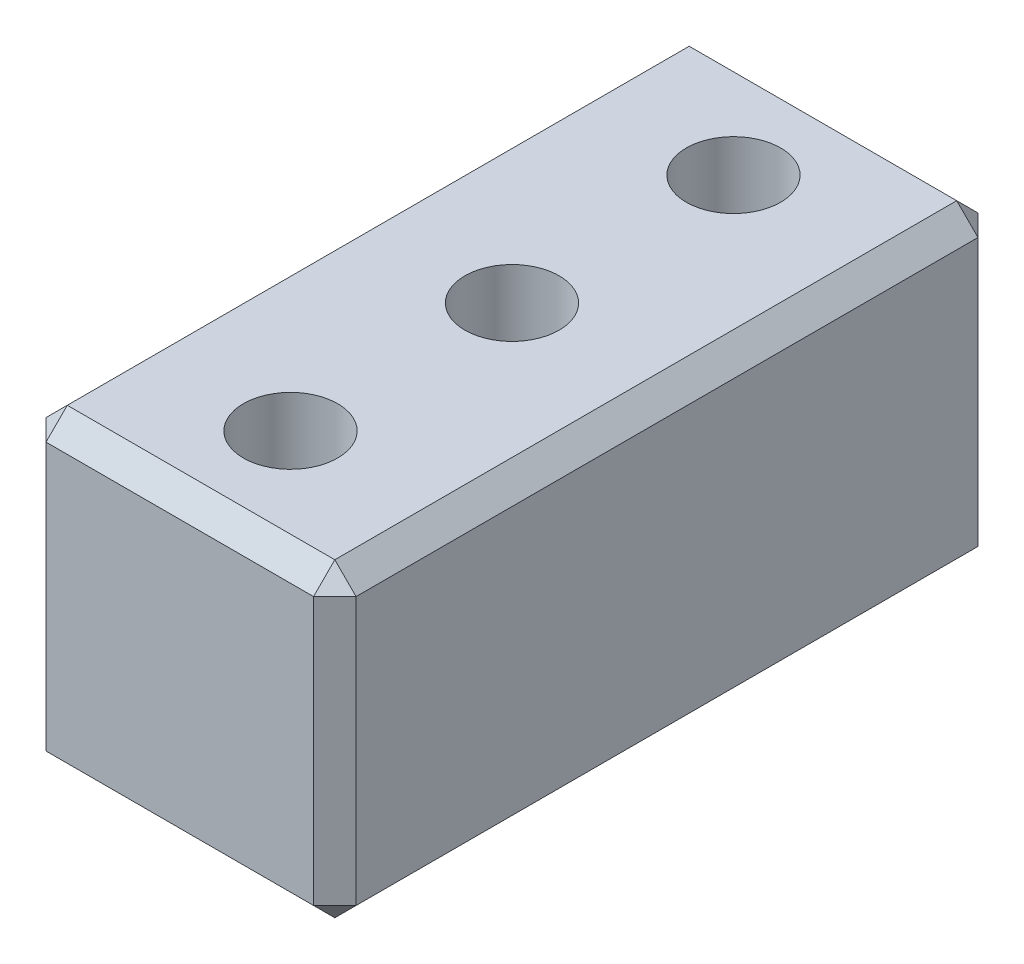
ISO-10303-21;
HEADER;
FILE_DESCRIPTION(('STEP AP214'),'2;1');
FILE_NAME('part.step','',(''),(''),'','','');
FILE_SCHEMA(('AUTOMOTIVE_DESIGN { 1 0 10303 214 1 1 1 1 }'));
ENDSEC;
DATA;
#1=APPLICATION_CONTEXT('core data for automotive mechanical design processes');
#2=APPLICATION_PROTOCOL_DEFINITION('international standard','automotive_design',2000,#1);
#3=PRODUCT_CONTEXT('',#1,'mechanical');
#4=PRODUCT('Part','Part','',(#3));
#5=PRODUCT_RELATED_PRODUCT_CATEGORY('part','',(#4));
#6=PRODUCT_DEFINITION_FORMATION('','',#4);
#7=PRODUCT_DEFINITION_CONTEXT('part definition',#1,'design');
#8=PRODUCT_DEFINITION('design','',#6,#7);
#9=PRODUCT_DEFINITION_SHAPE('','',#8);
#10=(LENGTH_UNIT() NAMED_UNIT(*) SI_UNIT(.MILLI.,.METRE.));
#11=(NAMED_UNIT(*) PLANE_ANGLE_UNIT() SI_UNIT($,.RADIAN.));
#12=(NAMED_UNIT(*) SI_UNIT($,.STERADIAN.) SOLID_ANGLE_UNIT());
#13=UNCERTAINTY_MEASURE_WITH_UNIT(LENGTH_MEASURE(1.E-05),#10,'distance_accuracy_value','');
#14=(GEOMETRIC_REPRESENTATION_CONTEXT(3) GLOBAL_UNCERTAINTY_ASSIGNED_CONTEXT((#13)) GLOBAL_UNIT_ASSIGNED_CONTEXT((#10,
#11,#12)) REPRESENTATION_CONTEXT('',''));
#15=CARTESIAN_POINT('',(0.,0.,0.));
#16=DIRECTION('',(0.,0.,1.));
#17=DIRECTION('',(1.,0.,0.));
#18=AXIS2_PLACEMENT_3D('',#15,#16,#17);
#19=CARTESIAN_POINT('',(-11.1125,-11.1125,23.8125));
#20=DIRECTION('',(1.,0.,0.));
#21=DIRECTION('',(0.,0.,-1.));
#22=AXIS2_PLACEMENT_3D('',#19,#20,#21);
#23=PLANE('',#22);
#24=DIRECTION('',(0.,1.,0.));
#25=VECTOR('',#24,1.);
#26=CARTESIAN_POINT('',(-11.1125,11.1125,22.2885));
#27=LINE('',#26,#25);
#28=CARTESIAN_POINT('',(-11.1125,-9.58849999999999,22.2885));
#29=VERTEX_POINT('',#28);
#30=CARTESIAN_POINT('',(-11.1125,9.5885,22.2885));
#31=VERTEX_POINT('',#30);
#32=EDGE_CURVE('E162',#29,#31,#27,.T.);
#33=ORIENTED_EDGE('',*,*,#32,.T.);
#34=DIRECTION('',(0.,0.,-1.));
#35=VECTOR('',#34,1.);
#36=CARTESIAN_POINT('',(-11.1125,9.5885,23.8125));
#37=LINE('',#36,#35);
#38=CARTESIAN_POINT('',(-11.1125,9.5885,-22.2885));
#39=VERTEX_POINT('',#38);
#40=EDGE_CURVE('E134',#31,#39,#37,.T.);
#41=ORIENTED_EDGE('',*,*,#40,.T.);
#42=DIRECTION('',(0.,-1.,0.));
#43=VECTOR('',#42,1.);
#44=CARTESIAN_POINT('',(-11.1125,-11.1125,-22.2885));
#45=LINE('',#44,#43);
#46=CARTESIAN_POINT('',(-11.1125,-9.58849999999999,-22.2885));
#47=VERTEX_POINT('',#46);
#48=EDGE_CURVE('E152',#39,#47,#45,.T.);
#49=ORIENTED_EDGE('',*,*,#48,.T.);
#50=DIRECTION('',(0.,0.,1.));
#51=VECTOR('',#50,1.);
#52=CARTESIAN_POINT('',(-11.1125,-9.58849999999999,23.8125));
#53=LINE('',#52,#51);
#54=EDGE_CURVE('E158',#47,#29,#53,.T.);
#55=ORIENTED_EDGE('',*,*,#54,.T.);
#56=EDGE_LOOP('',(#33,#41,#49,#55));
#57=FACE_BOUND('',#56,.T.);
#58=ADVANCED_FACE('F40',(#57),#23,.F.);
#59=CARTESIAN_POINT('',(11.1125,-11.1125,23.8125));
#60=DIRECTION('',(0.,1.,0.));
#61=DIRECTION('',(0.,0.,1.));
#62=AXIS2_PLACEMENT_3D('',#59,#60,#61);
#63=PLANE('',#62);
#64=DIRECTION('',(-1.,0.,0.));
#65=VECTOR('',#64,1.);
#66=CARTESIAN_POINT('',(-11.1125,-11.1125,22.2885));
#67=LINE('',#66,#65);
#68=CARTESIAN_POINT('',(9.5885,-11.1125,22.2885));
#69=VERTEX_POINT('',#68);
#70=CARTESIAN_POINT('',(-9.58850000000001,-11.1125,22.2885));
#71=VERTEX_POINT('',#70);
#72=EDGE_CURVE('E184',#69,#71,#67,.T.);
#73=ORIENTED_EDGE('',*,*,#72,.T.);
#74=DIRECTION('',(0.,0.,-1.));
#75=VECTOR('',#74,1.);
#76=CARTESIAN_POINT('',(-9.58850000000001,-11.1125,23.8125));
#77=LINE('',#76,#75);
#78=CARTESIAN_POINT('',(-9.58850000000001,-11.1125,-22.2885));
#79=VERTEX_POINT('',#78);
#80=EDGE_CURVE('E190',#71,#79,#77,.T.);
#81=ORIENTED_EDGE('',*,*,#80,.T.);
#82=DIRECTION('',(1.,0.,0.));
#83=VECTOR('',#82,1.);
#84=CARTESIAN_POINT('',(11.1125,-11.1125,-22.2885));
#85=LINE('',#84,#83);
#86=CARTESIAN_POINT('',(9.5885,-11.1125,-22.2885));
#87=VERTEX_POINT('',#86);
#88=EDGE_CURVE('E188',#79,#87,#85,.T.);
#89=ORIENTED_EDGE('',*,*,#88,.T.);
#90=DIRECTION('',(0.,0.,1.));
#91=VECTOR('',#90,1.);
#92=CARTESIAN_POINT('',(9.5885,-11.1125,23.8125));
#93=LINE('',#92,#91);
#94=EDGE_CURVE('E186',#87,#69,#93,.T.);
#95=ORIENTED_EDGE('',*,*,#94,.T.);
#96=EDGE_LOOP('',(#73,#81,#89,#95));
#97=FACE_BOUND('',#96,.T.);
#98=CARTESIAN_POINT('',(0.,-11.1125,-15.875));
#99=DIRECTION('',(0.,1.,0.));
#100=DIRECTION('',(0.,0.,1.));
#101=AXIS2_PLACEMENT_3D('',#98,#99,#100);
#102=CIRCLE('',#101,3.3782);
#103=CARTESIAN_POINT('',(0.,-11.1125,-12.4968));
#104=VERTEX_POINT('',#103);
#105=EDGE_CURVE('E267',#104,#104,#102,.T.);
#106=ORIENTED_EDGE('',*,*,#105,.T.);
#107=EDGE_LOOP('',(#106));
#108=FACE_BOUND('',#107,.T.);
#109=CARTESIAN_POINT('',(0.,-11.1125,15.875));
#110=DIRECTION('',(0.,1.,0.));
#111=DIRECTION('',(0.,0.,1.));
#112=AXIS2_PLACEMENT_3D('',#109,#110,#111);
#113=CIRCLE('',#112,3.3782);
#114=CARTESIAN_POINT('',(0.,-11.1125,19.2532));
#115=VERTEX_POINT('',#114);
#116=EDGE_CURVE('E277',#115,#115,#113,.T.);
#117=ORIENTED_EDGE('',*,*,#116,.T.);
#118=EDGE_LOOP('',(#117));
#119=FACE_BOUND('',#118,.T.);
#120=CARTESIAN_POINT('',(0.,-11.1125,0.));
#121=DIRECTION('',(0.,1.,0.));
#122=DIRECTION('',(0.,0.,1.));
#123=AXIS2_PLACEMENT_3D('',#120,#121,#122);
#124=CIRCLE('',#123,3.3782);
#125=CARTESIAN_POINT('',(0.,-11.1125,3.3782));
#126=VERTEX_POINT('',#125);
#127=EDGE_CURVE('E159',#126,#126,#124,.T.);
#128=ORIENTED_EDGE('',*,*,#127,.T.);
#129=EDGE_LOOP('',(#128));
#130=FACE_BOUND('',#129,.T.);
#131=ADVANCED_FACE('F338',(#97,#108,#119,#130),#63,.F.);
#132=CARTESIAN_POINT('',(11.1125,-11.1125,23.8125));
#133=DIRECTION('',(-1.,0.,0.));
#134=DIRECTION('',(0.,0.,1.));
#135=AXIS2_PLACEMENT_3D('',#132,#133,#134);
#136=PLANE('',#135);
#137=DIRECTION('',(0.,0.,-1.));
#138=VECTOR('',#137,1.);
#139=CARTESIAN_POINT('',(11.1125,-9.58849999999999,23.8125));
#140=LINE('',#139,#138);
#141=CARTESIAN_POINT('',(11.1125,-9.58849999999999,22.2885));
#142=VERTEX_POINT('',#141);
#143=CARTESIAN_POINT('',(11.1125,-9.58849999999999,-22.2885));
#144=VERTEX_POINT('',#143);
#145=EDGE_CURVE('E50',#142,#144,#140,.T.);
#146=ORIENTED_EDGE('',*,*,#145,.T.);
#147=DIRECTION('',(0.,1.,0.));
#148=VECTOR('',#147,1.);
#149=CARTESIAN_POINT('',(11.1125,-11.1125,-22.2885));
#150=LINE('',#149,#148);
#151=CARTESIAN_POINT('',(11.1125,9.5885,-22.2885));
#152=VERTEX_POINT('',#151);
#153=EDGE_CURVE('E11',#144,#152,#150,.T.);
#154=ORIENTED_EDGE('',*,*,#153,.T.);
#155=DIRECTION('',(0.,0.,1.));
#156=VECTOR('',#155,1.);
#157=CARTESIAN_POINT('',(11.1125,9.5885,23.8125));
#158=LINE('',#157,#156);
#159=CARTESIAN_POINT('',(11.1125,9.5885,22.2885));
#160=VERTEX_POINT('',#159);
#161=EDGE_CURVE('E202',#152,#160,#158,.T.);
#162=ORIENTED_EDGE('',*,*,#161,.T.);
#163=DIRECTION('',(0.,-1.,0.));
#164=VECTOR('',#163,1.);
#165=CARTESIAN_POINT('',(11.1125,-11.1125,22.2885));
#166=LINE('',#165,#164);
#167=EDGE_CURVE('E61',#160,#142,#166,.T.);
#168=ORIENTED_EDGE('',*,*,#167,.T.);
#169=EDGE_LOOP('',(#146,#154,#162,#168));
#170=FACE_BOUND('',#169,.T.);
#171=ADVANCED_FACE('F343',(#170),#136,.F.);
#172=CARTESIAN_POINT('',(11.1125,11.1125,23.8125));
#173=DIRECTION('',(0.,-1.,0.));
#174=DIRECTION('',(1.,0.,0.));
#175=AXIS2_PLACEMENT_3D('',#172,#173,#174);
#176=PLANE('',#175);
#177=DIRECTION('',(-1.,0.,0.));
#178=VECTOR('',#177,1.);
#179=CARTESIAN_POINT('',(11.1125,11.1125,-22.2885));
#180=LINE('',#179,#178);
#181=CARTESIAN_POINT('',(9.5885,11.1125,-22.2885));
#182=VERTEX_POINT('',#181);
#183=CARTESIAN_POINT('',(-9.58850000000001,11.1125,-22.2885));
#184=VERTEX_POINT('',#183);
#185=EDGE_CURVE('E172',#182,#184,#180,.T.);
#186=ORIENTED_EDGE('',*,*,#185,.T.);
#187=DIRECTION('',(0.,0.,1.));
#188=VECTOR('',#187,1.);
#189=CARTESIAN_POINT('',(-9.58850000000001,11.1125,23.8125));
#190=LINE('',#189,#188);
#191=CARTESIAN_POINT('',(-9.58850000000001,11.1125,22.2885));
#192=VERTEX_POINT('',#191);
#193=EDGE_CURVE('E136',#184,#192,#190,.T.);
#194=ORIENTED_EDGE('',*,*,#193,.T.);
#195=DIRECTION('',(1.,0.,0.));
#196=VECTOR('',#195,1.);
#197=CARTESIAN_POINT('',(11.1125,11.1125,22.2885));
#198=LINE('',#197,#196);
#199=CARTESIAN_POINT('',(9.5885,11.1125,22.2885));
#200=VERTEX_POINT('',#199);
#201=EDGE_CURVE('E166',#192,#200,#198,.T.);
#202=ORIENTED_EDGE('',*,*,#201,.T.);
#203=DIRECTION('',(0.,0.,-1.));
#204=VECTOR('',#203,1.);
#205=CARTESIAN_POINT('',(9.5885,11.1125,23.8125));
#206=LINE('',#205,#204);
#207=EDGE_CURVE('E164',#200,#182,#206,.T.);
#208=ORIENTED_EDGE('',*,*,#207,.T.);
#209=EDGE_LOOP('',(#186,#194,#202,#208));
#210=FACE_BOUND('',#209,.T.);
#211=CARTESIAN_POINT('',(0.,11.1125,-15.875));
#212=DIRECTION('',(0.,1.,0.));
#213=DIRECTION('',(0.,0.,1.));
#214=AXIS2_PLACEMENT_3D('',#211,#212,#213);
#215=CIRCLE('',#214,3.37819999999999);
#216=CARTESIAN_POINT('',(0.,11.1125,-12.4968));
#217=VERTEX_POINT('',#216);
#218=EDGE_CURVE('E261',#217,#217,#215,.T.);
#219=ORIENTED_EDGE('',*,*,#218,.F.);
#220=EDGE_LOOP('',(#219));
#221=FACE_BOUND('',#220,.T.);
#222=CARTESIAN_POINT('',(0.,11.1125,15.875));
#223=DIRECTION('',(0.,1.,0.));
#224=DIRECTION('',(0.,0.,1.));
#225=AXIS2_PLACEMENT_3D('',#222,#223,#224);
#226=CIRCLE('',#225,3.37819999999999);
#227=CARTESIAN_POINT('',(0.,11.1125,19.2532));
#228=VERTEX_POINT('',#227);
#229=EDGE_CURVE('E272',#228,#228,#226,.T.);
#230=ORIENTED_EDGE('',*,*,#229,.F.);
#231=EDGE_LOOP('',(#230));
#232=FACE_BOUND('',#231,.T.);
#233=CARTESIAN_POINT('',(0.,11.1125,0.));
#234=DIRECTION('',(0.,1.,0.));
#235=DIRECTION('',(0.,0.,1.));
#236=AXIS2_PLACEMENT_3D('',#233,#234,#235);
#237=CIRCLE('',#236,3.37819999999999);
#238=CARTESIAN_POINT('',(0.,11.1125,3.37819999999999));
#239=VERTEX_POINT('',#238);
#240=EDGE_CURVE('E280',#239,#239,#237,.T.);
#241=ORIENTED_EDGE('',*,*,#240,.F.);
#242=EDGE_LOOP('',(#241));
#243=FACE_BOUND('',#242,.T.);
#244=ADVANCED_FACE('F308',(#210,#221,#232,#243),#176,.F.);
#245=CARTESIAN_POINT('',(0.,0.,23.8125));
#246=DIRECTION('',(0.,0.,1.));
#247=DIRECTION('',(1.,0.,0.));
#248=AXIS2_PLACEMENT_3D('',#245,#246,#247);
#249=PLANE('',#248);
#250=DIRECTION('',(-1.,0.,0.));
#251=VECTOR('',#250,1.);
#252=CARTESIAN_POINT('',(-11.1125,9.5885,23.8125));
#253=LINE('',#252,#251);
#254=CARTESIAN_POINT('',(9.5885,9.5885,23.8125));
#255=VERTEX_POINT('',#254);
#256=CARTESIAN_POINT('',(-9.58850000000001,9.5885,23.8125));
#257=VERTEX_POINT('',#256);
#258=EDGE_CURVE('E175',#255,#257,#253,.T.);
#259=ORIENTED_EDGE('',*,*,#258,.T.);
#260=DIRECTION('',(0.,-1.,0.));
#261=VECTOR('',#260,1.);
#262=CARTESIAN_POINT('',(-9.58850000000001,-11.1125,23.8125));
#263=LINE('',#262,#261);
#264=CARTESIAN_POINT('',(-9.58850000000001,-9.58849999999999,23.8125));
#265=VERTEX_POINT('',#264);
#266=EDGE_CURVE('E181',#257,#265,#263,.T.);
#267=ORIENTED_EDGE('',*,*,#266,.T.);
#268=DIRECTION('',(1.,0.,0.));
#269=VECTOR('',#268,1.);
#270=CARTESIAN_POINT('',(11.1125,-9.58849999999999,23.8125));
#271=LINE('',#270,#269);
#272=CARTESIAN_POINT('',(9.5885,-9.58849999999999,23.8125));
#273=VERTEX_POINT('',#272);
#274=EDGE_CURVE('E179',#265,#273,#271,.T.);
#275=ORIENTED_EDGE('',*,*,#274,.T.);
#276=DIRECTION('',(0.,1.,0.));
#277=VECTOR('',#276,1.);
#278=CARTESIAN_POINT('',(9.5885,11.1125,23.8125));
#279=LINE('',#278,#277);
#280=EDGE_CURVE('E177',#273,#255,#279,.T.);
#281=ORIENTED_EDGE('',*,*,#280,.T.);
#282=EDGE_LOOP('',(#259,#267,#275,#281));
#283=FACE_BOUND('',#282,.T.);
#284=ADVANCED_FACE('F455',(#283),#249,.T.);
#285=CARTESIAN_POINT('',(0.,0.,-23.8125));
#286=DIRECTION('',(0.,0.,1.));
#287=DIRECTION('',(1.,0.,0.));
#288=AXIS2_PLACEMENT_3D('',#285,#286,#287);
#289=PLANE('',#288);
#290=DIRECTION('',(-1.,0.,0.));
#291=VECTOR('',#290,1.);
#292=CARTESIAN_POINT('',(0.,-9.58849999999999,-23.8125));
#293=LINE('',#292,#291);
#294=CARTESIAN_POINT('',(9.5885,-9.58849999999999,-23.8125));
#295=VERTEX_POINT('',#294);
#296=CARTESIAN_POINT('',(-9.5885,-9.58849999999999,-23.8125));
#297=VERTEX_POINT('',#296);
#298=EDGE_CURVE('E193',#295,#297,#293,.T.);
#299=ORIENTED_EDGE('',*,*,#298,.T.);
#300=DIRECTION('',(0.,1.,0.));
#301=VECTOR('',#300,1.);
#302=CARTESIAN_POINT('',(-9.5885,0.,-23.8125));
#303=LINE('',#302,#301);
#304=CARTESIAN_POINT('',(-9.5885,9.5885,-23.8125));
#305=VERTEX_POINT('',#304);
#306=EDGE_CURVE('E199',#297,#305,#303,.T.);
#307=ORIENTED_EDGE('',*,*,#306,.T.);
#308=DIRECTION('',(1.,0.,0.));
#309=VECTOR('',#308,1.);
#310=CARTESIAN_POINT('',(0.,9.5885,-23.8125));
#311=LINE('',#310,#309);
#312=CARTESIAN_POINT('',(9.5885,9.5885,-23.8125));
#313=VERTEX_POINT('',#312);
#314=EDGE_CURVE('E197',#305,#313,#311,.T.);
#315=ORIENTED_EDGE('',*,*,#314,.T.);
#316=DIRECTION('',(0.,-1.,0.));
#317=VECTOR('',#316,1.);
#318=CARTESIAN_POINT('',(9.5885,0.,-23.8125));
#319=LINE('',#318,#317);
#320=EDGE_CURVE('E195',#313,#295,#319,.T.);
#321=ORIENTED_EDGE('',*,*,#320,.T.);
#322=EDGE_LOOP('',(#299,#307,#315,#321));
#323=FACE_BOUND('',#322,.T.);
#324=ADVANCED_FACE('F317',(#323),#289,.F.);
#325=CARTESIAN_POINT('',(0.,11.1125,0.));
#326=DIRECTION('',(0.,1.,0.));
#327=DIRECTION('',(0.,0.,1.));
#328=AXIS2_PLACEMENT_3D('',#325,#326,#327);
#329=CYLINDRICAL_SURFACE('',#328,3.37819999999999);
#330=ORIENTED_EDGE('',*,*,#127,.F.);
#331=EDGE_LOOP('',(#330));
#332=FACE_BOUND('',#331,.T.);
#333=ORIENTED_EDGE('',*,*,#240,.T.);
#334=EDGE_LOOP('',(#333));
#335=FACE_BOUND('',#334,.T.);
#336=ADVANCED_FACE('F462',(#332,#335),#329,.F.);
#337=CARTESIAN_POINT('',(0.,11.1125,15.875));
#338=DIRECTION('',(0.,1.,0.));
#339=DIRECTION('',(0.,0.,1.));
#340=AXIS2_PLACEMENT_3D('',#337,#338,#339);
#341=CYLINDRICAL_SURFACE('',#340,3.37819999999999);
#342=ORIENTED_EDGE('',*,*,#116,.F.);
#343=EDGE_LOOP('',(#342));
#344=FACE_BOUND('',#343,.T.);
#345=ORIENTED_EDGE('',*,*,#229,.T.);
#346=EDGE_LOOP('',(#345));
#347=FACE_BOUND('',#346,.T.);
#348=ADVANCED_FACE('F663',(#344,#347),#341,.F.);
#349=CARTESIAN_POINT('',(0.,11.1125,-15.875));
#350=DIRECTION('',(0.,1.,0.));
#351=DIRECTION('',(0.,0.,1.));
#352=AXIS2_PLACEMENT_3D('',#349,#350,#351);
#353=CYLINDRICAL_SURFACE('',#352,3.37819999999999);
#354=ORIENTED_EDGE('',*,*,#105,.F.);
#355=EDGE_LOOP('',(#354));
#356=FACE_BOUND('',#355,.T.);
#357=ORIENTED_EDGE('',*,*,#218,.T.);
#358=EDGE_LOOP('',(#357));
#359=FACE_BOUND('',#358,.T.);
#360=ADVANCED_FACE('F438',(#356,#359),#353,.F.);
#361=CARTESIAN_POINT('',(11.1125,-9.58849999999999,23.8125));
#362=DIRECTION('',(-0.707106781186549,0.707106781186546,0.));
#363=DIRECTION('',(0.,0.,-1.));
#364=AXIS2_PLACEMENT_3D('',#361,#362,#363);
#365=PLANE('',#364);
#366=DIRECTION('',(-0.707106781186546,-0.707106781186549,0.));
#367=VECTOR('',#366,1.);
#368=CARTESIAN_POINT('',(9.5885,-11.1125,22.2885));
#369=LINE('',#368,#367);
#370=EDGE_CURVE('E45',#69,#142,#369,.F.);
#371=ORIENTED_EDGE('',*,*,#370,.F.);
#372=ORIENTED_EDGE('',*,*,#94,.F.);
#373=DIRECTION('',(0.707106781186546,0.707106781186549,0.));
#374=VECTOR('',#373,1.);
#375=CARTESIAN_POINT('',(10.3505,-10.3505,-22.2885));
#376=LINE('',#375,#374);
#377=EDGE_CURVE('E255',#144,#87,#376,.F.);
#378=ORIENTED_EDGE('',*,*,#377,.F.);
#379=ORIENTED_EDGE('',*,*,#145,.F.);
#380=EDGE_LOOP('',(#371,#372,#378,#379));
#381=FACE_BOUND('',#380,.T.);
#382=ADVANCED_FACE('F43',(#381),#365,.F.);
#383=CARTESIAN_POINT('',(9.5885,-11.1125,22.2885));
#384=DIRECTION('',(0.577350269189628,-0.577350269189626,0.577350269189623));
#385=DIRECTION('',(0.707106781186546,0.707106781186549,0.));
#386=AXIS2_PLACEMENT_3D('',#383,#384,#385);
#387=PLANE('',#386);
#388=DIRECTION('',(0.,-0.707106781186546,-0.707106781186549));
#389=VECTOR('',#388,1.);
#390=CARTESIAN_POINT('',(9.5885,-11.1125,22.2885));
#391=LINE('',#390,#389);
#392=EDGE_CURVE('E250',#69,#273,#391,.F.);
#393=ORIENTED_EDGE('',*,*,#392,.F.);
#394=ORIENTED_EDGE('',*,*,#370,.T.);
#395=DIRECTION('',(-0.707106781186546,0.,0.707106781186549));
#396=VECTOR('',#395,1.);
#397=CARTESIAN_POINT('',(10.3505,-9.58849999999999,23.0505));
#398=LINE('',#397,#396);
#399=EDGE_CURVE('E253',#273,#142,#398,.F.);
#400=ORIENTED_EDGE('',*,*,#399,.F.);
#401=EDGE_LOOP('',(#393,#394,#400));
#402=FACE_BOUND('',#401,.T.);
#403=ADVANCED_FACE('F430',(#402),#387,.T.);
#404=CARTESIAN_POINT('',(9.5885,-9.58849999999999,-23.8125));
#405=DIRECTION('',(0.577350269189628,-0.577350269189623,-0.577350269189626));
#406=DIRECTION('',(-0.707106781186546,0.,-0.707106781186549));
#407=AXIS2_PLACEMENT_3D('',#404,#405,#406);
#408=PLANE('',#407);
#409=DIRECTION('',(-0.707106781186546,0.,-0.707106781186549));
#410=VECTOR('',#409,1.);
#411=CARTESIAN_POINT('',(9.5885,-9.58849999999999,-23.8125));
#412=LINE('',#411,#410);
#413=EDGE_CURVE('E244',#144,#295,#412,.T.);
#414=ORIENTED_EDGE('',*,*,#413,.F.);
#415=ORIENTED_EDGE('',*,*,#377,.T.);
#416=DIRECTION('',(0.,-0.707106781186549,0.707106781186546));
#417=VECTOR('',#416,1.);
#418=CARTESIAN_POINT('',(9.5885,-9.58849999999999,-23.8125));
#419=LINE('',#418,#417);
#420=EDGE_CURVE('E247',#295,#87,#419,.T.);
#421=ORIENTED_EDGE('',*,*,#420,.F.);
#422=EDGE_LOOP('',(#414,#415,#421));
#423=FACE_BOUND('',#422,.T.);
#424=ADVANCED_FACE('F427',(#423),#408,.T.);
#425=CARTESIAN_POINT('',(9.5885,0.,23.8125));
#426=DIRECTION('',(0.707106781186549,0.,0.707106781186546));
#427=DIRECTION('',(0.,-1.,0.));
#428=AXIS2_PLACEMENT_3D('',#425,#426,#427);
#429=PLANE('',#428);
#430=ORIENTED_EDGE('',*,*,#399,.T.);
#431=ORIENTED_EDGE('',*,*,#167,.F.);
#432=DIRECTION('',(0.707106781186546,0.,-0.707106781186549));
#433=VECTOR('',#432,1.);
#434=CARTESIAN_POINT('',(9.5885,9.5885,23.8125));
#435=LINE('',#434,#433);
#436=EDGE_CURVE('E238',#255,#160,#435,.T.);
#437=ORIENTED_EDGE('',*,*,#436,.F.);
#438=ORIENTED_EDGE('',*,*,#280,.F.);
#439=EDGE_LOOP('',(#430,#431,#437,#438));
#440=FACE_BOUND('',#439,.T.);
#441=ADVANCED_FACE('F422',(#440),#429,.T.);
#442=CARTESIAN_POINT('',(0.,-9.58849999999999,23.8125));
#443=DIRECTION('',(0.,-0.707106781186549,0.707106781186546));
#444=DIRECTION('',(-1.,0.,0.));
#445=AXIS2_PLACEMENT_3D('',#442,#443,#444);
#446=PLANE('',#445);
#447=ORIENTED_EDGE('',*,*,#392,.T.);
#448=ORIENTED_EDGE('',*,*,#274,.F.);
#449=DIRECTION('',(0.,0.707106781186546,0.707106781186549));
#450=VECTOR('',#449,1.);
#451=CARTESIAN_POINT('',(-9.58850000000001,-9.58849999999999,23.8125));
#452=LINE('',#451,#450);
#453=EDGE_CURVE('E235',#71,#265,#452,.T.);
#454=ORIENTED_EDGE('',*,*,#453,.F.);
#455=ORIENTED_EDGE('',*,*,#72,.F.);
#456=EDGE_LOOP('',(#447,#448,#454,#455));
#457=FACE_BOUND('',#456,.T.);
#458=ADVANCED_FACE('F417',(#457),#446,.T.);
#459=CARTESIAN_POINT('',(-9.58850000000001,-11.1125,23.8125));
#460=DIRECTION('',(0.707106781186549,0.707106781186546,0.));
#461=DIRECTION('',(0.,0.,-1.));
#462=AXIS2_PLACEMENT_3D('',#459,#460,#461);
#463=PLANE('',#462);
#464=DIRECTION('',(0.707106781186546,-0.707106781186549,0.));
#465=VECTOR('',#464,1.);
#466=CARTESIAN_POINT('',(-9.58850000000001,-11.1125,-22.2885));
#467=LINE('',#466,#465);
#468=EDGE_CURVE('E229',#79,#47,#467,.F.);
#469=ORIENTED_EDGE('',*,*,#468,.F.);
#470=ORIENTED_EDGE('',*,*,#80,.F.);
#471=DIRECTION('',(-0.707106781186546,0.707106781186549,0.));
#472=VECTOR('',#471,1.);
#473=CARTESIAN_POINT('',(-10.3505,-10.3505,22.2885));
#474=LINE('',#473,#472);
#475=EDGE_CURVE('E232',#29,#71,#474,.F.);
#476=ORIENTED_EDGE('',*,*,#475,.F.);
#477=ORIENTED_EDGE('',*,*,#54,.F.);
#478=EDGE_LOOP('',(#469,#470,#476,#477));
#479=FACE_BOUND('',#478,.T.);
#480=ADVANCED_FACE('F289',(#479),#463,.F.);
#481=CARTESIAN_POINT('',(11.1125,-11.1125,-22.2885));
#482=DIRECTION('',(0.,0.707106781186546,0.707106781186549));
#483=DIRECTION('',(1.,0.,0.));
#484=AXIS2_PLACEMENT_3D('',#481,#482,#483);
#485=PLANE('',#484);
#486=ORIENTED_EDGE('',*,*,#420,.T.);
#487=ORIENTED_EDGE('',*,*,#88,.F.);
#488=DIRECTION('',(0.,0.707106781186549,-0.707106781186546));
#489=VECTOR('',#488,1.);
#490=CARTESIAN_POINT('',(-9.58850000000001,-11.1125,-22.2885));
#491=LINE('',#490,#489);
#492=EDGE_CURVE('E227',#297,#79,#491,.F.);
#493=ORIENTED_EDGE('',*,*,#492,.F.);
#494=ORIENTED_EDGE('',*,*,#298,.F.);
#495=EDGE_LOOP('',(#486,#487,#493,#494));
#496=FACE_BOUND('',#495,.T.);
#497=ADVANCED_FACE('F322',(#496),#485,.F.);
#498=CARTESIAN_POINT('',(11.1125,-11.1125,-22.2885));
#499=DIRECTION('',(-0.707106781186549,0.,0.707106781186546));
#500=DIRECTION('',(0.,1.,0.));
#501=AXIS2_PLACEMENT_3D('',#498,#499,#500);
#502=PLANE('',#501);
#503=ORIENTED_EDGE('',*,*,#413,.T.);
#504=ORIENTED_EDGE('',*,*,#320,.F.);
#505=DIRECTION('',(0.707106781186546,0.,0.707106781186549));
#506=VECTOR('',#505,1.);
#507=CARTESIAN_POINT('',(9.5885,9.5885,-23.8125));
#508=LINE('',#507,#506);
#509=EDGE_CURVE('E224',#152,#313,#508,.F.);
#510=ORIENTED_EDGE('',*,*,#509,.F.);
#511=ORIENTED_EDGE('',*,*,#153,.F.);
#512=EDGE_LOOP('',(#503,#504,#510,#511));
#513=FACE_BOUND('',#512,.T.);
#514=ADVANCED_FACE('F404',(#513),#502,.F.);
#515=CARTESIAN_POINT('',(9.5885,11.1125,23.8125));
#516=DIRECTION('',(-0.707106781186549,-0.707106781186546,0.));
#517=DIRECTION('',(0.,0.,-1.));
#518=AXIS2_PLACEMENT_3D('',#515,#516,#517);
#519=PLANE('',#518);
#520=DIRECTION('',(0.707106781186546,-0.707106781186549,0.));
#521=VECTOR('',#520,1.);
#522=CARTESIAN_POINT('',(10.3505,10.3505,22.2885));
#523=LINE('',#522,#521);
#524=EDGE_CURVE('E241',#160,#200,#523,.F.);
#525=ORIENTED_EDGE('',*,*,#524,.F.);
#526=ORIENTED_EDGE('',*,*,#161,.F.);
#527=DIRECTION('',(-0.707106781186546,0.707106781186549,0.));
#528=VECTOR('',#527,1.);
#529=CARTESIAN_POINT('',(10.3505,10.3505,-22.2885));
#530=LINE('',#529,#528);
#531=EDGE_CURVE('E222',#182,#152,#530,.F.);
#532=ORIENTED_EDGE('',*,*,#531,.F.);
#533=ORIENTED_EDGE('',*,*,#207,.F.);
#534=EDGE_LOOP('',(#525,#526,#532,#533));
#535=FACE_BOUND('',#534,.T.);
#536=ADVANCED_FACE('F399',(#535),#519,.F.);
#537=CARTESIAN_POINT('',(9.5885,9.5885,23.8125));
#538=DIRECTION('',(0.577350269189628,0.577350269189623,0.577350269189626));
#539=DIRECTION('',(0.707106781186546,0.,-0.707106781186549));
#540=AXIS2_PLACEMENT_3D('',#537,#538,#539);
#541=PLANE('',#540);
#542=ORIENTED_EDGE('',*,*,#436,.T.);
#543=ORIENTED_EDGE('',*,*,#524,.T.);
#544=DIRECTION('',(0.,-0.707106781186549,0.707106781186546));
#545=VECTOR('',#544,1.);
#546=CARTESIAN_POINT('',(9.5885,9.5885,23.8125));
#547=LINE('',#546,#545);
#548=EDGE_CURVE('E219',#255,#200,#547,.F.);
#549=ORIENTED_EDGE('',*,*,#548,.F.);
#550=EDGE_LOOP('',(#542,#543,#549));
#551=FACE_BOUND('',#550,.T.);
#552=ADVANCED_FACE('F334',(#551),#541,.T.);
#553=CARTESIAN_POINT('',(-9.58850000000001,-9.58849999999999,23.8125));
#554=DIRECTION('',(-0.577350269189628,-0.577350269189626,0.577350269189623));
#555=DIRECTION('',(0.707106781186546,-0.707106781186549,0.));
#556=AXIS2_PLACEMENT_3D('',#553,#554,#555);
#557=PLANE('',#556);
#558=ORIENTED_EDGE('',*,*,#475,.T.);
#559=ORIENTED_EDGE('',*,*,#453,.T.);
#560=DIRECTION('',(-0.707106781186546,0.,-0.707106781186549));
#561=VECTOR('',#560,1.);
#562=CARTESIAN_POINT('',(-9.58850000000001,-9.58849999999999,23.8125));
#563=LINE('',#562,#561);
#564=EDGE_CURVE('E217',#29,#265,#563,.F.);
#565=ORIENTED_EDGE('',*,*,#564,.F.);
#566=EDGE_LOOP('',(#558,#559,#565));
#567=FACE_BOUND('',#566,.T.);
#568=ADVANCED_FACE('F292',(#567),#557,.T.);
#569=CARTESIAN_POINT('',(-9.58850000000001,-11.1125,-22.2885));
#570=DIRECTION('',(-0.577350269189626,-0.577350269189623,-0.577350269189628));
#571=DIRECTION('',(-0.707106781186549,0.,0.707106781186546));
#572=AXIS2_PLACEMENT_3D('',#569,#570,#571);
#573=PLANE('',#572);
#574=ORIENTED_EDGE('',*,*,#492,.T.);
#575=ORIENTED_EDGE('',*,*,#468,.T.);
#576=DIRECTION('',(-0.707106781186549,0.,0.707106781186546));
#577=VECTOR('',#576,1.);
#578=CARTESIAN_POINT('',(-10.3505,-9.58849999999999,-23.0505));
#579=LINE('',#578,#577);
#580=EDGE_CURVE('E155',#297,#47,#579,.T.);
#581=ORIENTED_EDGE('',*,*,#580,.F.);
#582=EDGE_LOOP('',(#574,#575,#581));
#583=FACE_BOUND('',#582,.T.);
#584=ADVANCED_FACE('F324',(#583),#573,.T.);
#585=CARTESIAN_POINT('',(9.5885,9.5885,-23.8125));
#586=DIRECTION('',(0.577350269189628,0.577350269189623,-0.577350269189626));
#587=DIRECTION('',(-0.707106781186546,0.,-0.707106781186549));
#588=AXIS2_PLACEMENT_3D('',#585,#586,#587);
#589=PLANE('',#588);
#590=ORIENTED_EDGE('',*,*,#531,.T.);
#591=ORIENTED_EDGE('',*,*,#509,.T.);
#592=DIRECTION('',(0.,-0.707106781186549,-0.707106781186546));
#593=VECTOR('',#592,1.);
#594=CARTESIAN_POINT('',(9.5885,9.5885,-23.8125));
#595=LINE('',#594,#593);
#596=EDGE_CURVE('E213',#182,#313,#595,.T.);
#597=ORIENTED_EDGE('',*,*,#596,.F.);
#598=EDGE_LOOP('',(#590,#591,#597));
#599=FACE_BOUND('',#598,.T.);
#600=ADVANCED_FACE('F326',(#599),#589,.T.);
#601=CARTESIAN_POINT('',(0.,9.5885,23.8125));
#602=DIRECTION('',(0.,0.707106781186546,0.707106781186549));
#603=DIRECTION('',(1.,0.,0.));
#604=AXIS2_PLACEMENT_3D('',#601,#602,#603);
#605=PLANE('',#604);
#606=ORIENTED_EDGE('',*,*,#548,.T.);
#607=ORIENTED_EDGE('',*,*,#201,.F.);
#608=DIRECTION('',(0.,0.707106781186549,-0.707106781186546));
#609=VECTOR('',#608,1.);
#610=CARTESIAN_POINT('',(-9.58850000000001,11.1125,22.2885));
#611=LINE('',#610,#609);
#612=EDGE_CURVE('E210',#257,#192,#611,.T.);
#613=ORIENTED_EDGE('',*,*,#612,.F.);
#614=ORIENTED_EDGE('',*,*,#258,.F.);
#615=EDGE_LOOP('',(#606,#607,#613,#614));
#616=FACE_BOUND('',#615,.T.);
#617=ADVANCED_FACE('F304',(#616),#605,.T.);
#618=CARTESIAN_POINT('',(-9.58850000000001,0.,23.8125));
#619=DIRECTION('',(-0.707106781186549,0.,0.707106781186546));
#620=DIRECTION('',(0.,1.,0.));
#621=AXIS2_PLACEMENT_3D('',#618,#619,#620);
#622=PLANE('',#621);
#623=ORIENTED_EDGE('',*,*,#564,.T.);
#624=ORIENTED_EDGE('',*,*,#266,.F.);
#625=DIRECTION('',(0.707106781186546,0.,0.707106781186549));
#626=VECTOR('',#625,1.);
#627=CARTESIAN_POINT('',(-10.3505,9.5885,23.0505));
#628=LINE('',#627,#626);
#629=EDGE_CURVE('E149',#31,#257,#628,.T.);
#630=ORIENTED_EDGE('',*,*,#629,.F.);
#631=ORIENTED_EDGE('',*,*,#32,.F.);
#632=EDGE_LOOP('',(#623,#624,#630,#631));
#633=FACE_BOUND('',#632,.T.);
#634=ADVANCED_FACE('F296',(#633),#622,.T.);
#635=CARTESIAN_POINT('',(-11.1125,-11.1125,-22.2885));
#636=DIRECTION('',(0.707106781186546,0.,0.707106781186549));
#637=DIRECTION('',(0.,-1.,0.));
#638=AXIS2_PLACEMENT_3D('',#635,#636,#637);
#639=PLANE('',#638);
#640=ORIENTED_EDGE('',*,*,#580,.T.);
#641=ORIENTED_EDGE('',*,*,#48,.F.);
#642=DIRECTION('',(0.707106781186549,0.,-0.707106781186546));
#643=VECTOR('',#642,1.);
#644=CARTESIAN_POINT('',(-11.1125,9.5885,-22.2885));
#645=LINE('',#644,#643);
#646=EDGE_CURVE('E141',#305,#39,#645,.F.);
#647=ORIENTED_EDGE('',*,*,#646,.F.);
#648=ORIENTED_EDGE('',*,*,#306,.F.);
#649=EDGE_LOOP('',(#640,#641,#647,#648));
#650=FACE_BOUND('',#649,.T.);
#651=ADVANCED_FACE('F153',(#650),#639,.F.);
#652=CARTESIAN_POINT('',(11.1125,11.1125,-22.2885));
#653=DIRECTION('',(0.,-0.707106781186546,0.707106781186549));
#654=DIRECTION('',(-1.,0.,0.));
#655=AXIS2_PLACEMENT_3D('',#652,#653,#654);
#656=PLANE('',#655);
#657=ORIENTED_EDGE('',*,*,#596,.T.);
#658=ORIENTED_EDGE('',*,*,#314,.F.);
#659=DIRECTION('',(0.,0.707106781186549,0.707106781186546));
#660=VECTOR('',#659,1.);
#661=CARTESIAN_POINT('',(-9.5885,10.3505,-23.0505));
#662=LINE('',#661,#660);
#663=EDGE_CURVE('E145',#184,#305,#662,.F.);
#664=ORIENTED_EDGE('',*,*,#663,.F.);
#665=ORIENTED_EDGE('',*,*,#185,.F.);
#666=EDGE_LOOP('',(#657,#658,#664,#665));
#667=FACE_BOUND('',#666,.T.);
#668=ADVANCED_FACE('F313',(#667),#656,.F.);
#669=CARTESIAN_POINT('',(-9.58850000000001,11.1125,22.2885));
#670=DIRECTION('',(-0.577350269189628,0.577350269189623,0.577350269189626));
#671=DIRECTION('',(0.707106781186546,0.,0.707106781186549));
#672=AXIS2_PLACEMENT_3D('',#669,#670,#671);
#673=PLANE('',#672);
#674=ORIENTED_EDGE('',*,*,#629,.T.);
#675=ORIENTED_EDGE('',*,*,#612,.T.);
#676=DIRECTION('',(0.707106781186546,0.707106781186549,0.));
#677=VECTOR('',#676,1.);
#678=CARTESIAN_POINT('',(-9.58850000000001,11.1125,22.2885));
#679=LINE('',#678,#677);
#680=EDGE_CURVE('E138',#31,#192,#679,.T.);
#681=ORIENTED_EDGE('',*,*,#680,.F.);
#682=EDGE_LOOP('',(#674,#675,#681));
#683=FACE_BOUND('',#682,.T.);
#684=ADVANCED_FACE('F300',(#683),#673,.T.);
#685=CARTESIAN_POINT('',(-11.1125,9.5885,-22.2885));
#686=DIRECTION('',(-0.577350269189626,0.577350269189623,-0.577350269189628));
#687=DIRECTION('',(-0.707106781186549,0.,0.707106781186546));
#688=AXIS2_PLACEMENT_3D('',#685,#686,#687);
#689=PLANE('',#688);
#690=ORIENTED_EDGE('',*,*,#663,.T.);
#691=ORIENTED_EDGE('',*,*,#646,.T.);
#692=DIRECTION('',(-0.707106781186546,-0.707106781186549,0.));
#693=VECTOR('',#692,1.);
#694=CARTESIAN_POINT('',(-11.1125,9.5885,-22.2885));
#695=LINE('',#694,#693);
#696=EDGE_CURVE('E130',#184,#39,#695,.T.);
#697=ORIENTED_EDGE('',*,*,#696,.F.);
#698=EDGE_LOOP('',(#690,#691,#697));
#699=FACE_BOUND('',#698,.T.);
#700=ADVANCED_FACE('F143',(#699),#689,.T.);
#701=CARTESIAN_POINT('',(-11.1125,9.5885,23.8125));
#702=DIRECTION('',(0.707106781186549,-0.707106781186546,0.));
#703=DIRECTION('',(0.,0.,-1.));
#704=AXIS2_PLACEMENT_3D('',#701,#702,#703);
#705=PLANE('',#704);
#706=ORIENTED_EDGE('',*,*,#680,.T.);
#707=ORIENTED_EDGE('',*,*,#193,.F.);
#708=ORIENTED_EDGE('',*,*,#696,.T.);
#709=ORIENTED_EDGE('',*,*,#40,.F.);
#710=EDGE_LOOP('',(#706,#707,#708,#709));
#711=FACE_BOUND('',#710,.T.);
#712=ADVANCED_FACE('F132',(#711),#705,.F.);
#713=CLOSED_SHELL('',(#58,#131,#171,#244,#284,#324,#336,#348,#360,#382,#403,#424,#441,#458,#480,
#497,#514,#536,#552,#568,#584,#600,#617,#634,#651,#668,#684,#700,#712));
#714=MANIFOLD_SOLID_BREP('B2',#713);
#715=ADVANCED_BREP_SHAPE_REPRESENTATION('',(#18,#714),#14);
#716=SHAPE_DEFINITION_REPRESENTATION(#9,#715);
ENDSEC;
END-ISO-10303-21;
